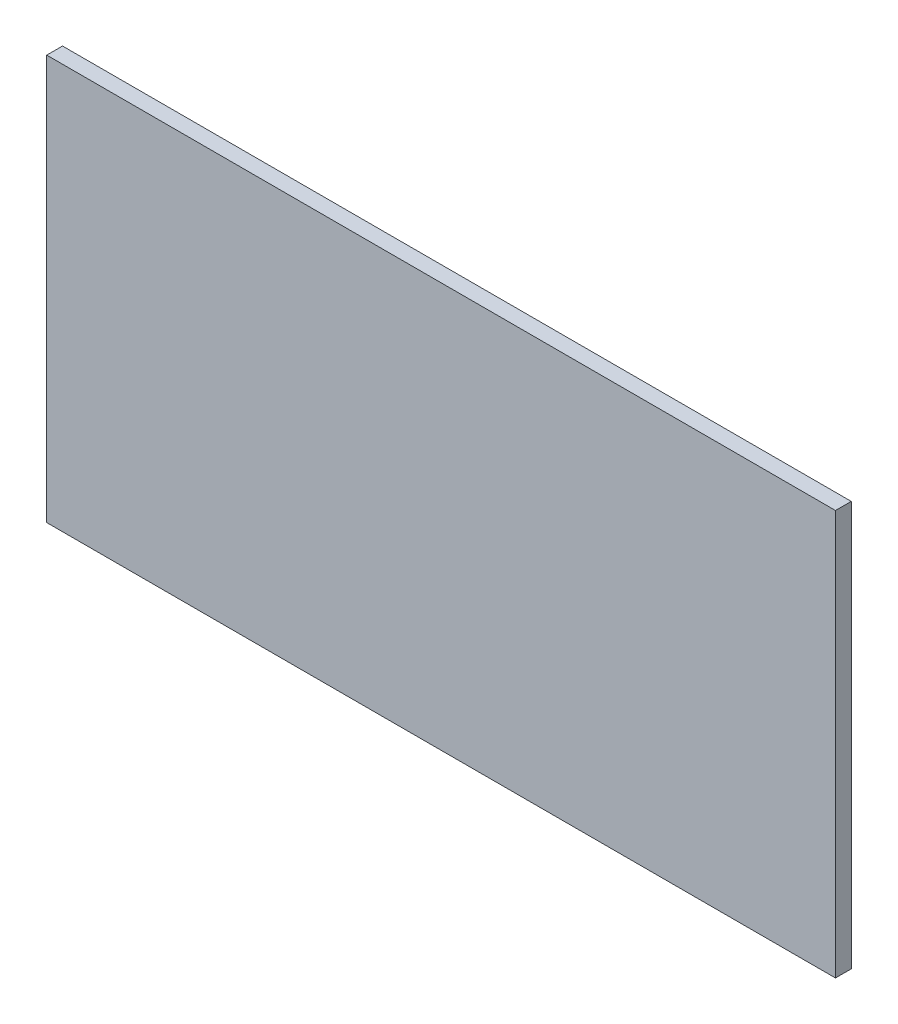
ISO-10303-21;
HEADER;
FILE_DESCRIPTION(('STEP AP214'),'2;1');
FILE_NAME('part.step','',(''),(''),'','','');
FILE_SCHEMA(('AUTOMOTIVE_DESIGN { 1 0 10303 214 1 1 1 1 }'));
ENDSEC;
DATA;
#1=APPLICATION_CONTEXT('core data for automotive mechanical design processes');
#2=APPLICATION_PROTOCOL_DEFINITION('international standard','automotive_design',2000,#1);
#3=PRODUCT_CONTEXT('',#1,'mechanical');
#4=PRODUCT('Part','Part','',(#3));
#5=PRODUCT_RELATED_PRODUCT_CATEGORY('part','',(#4));
#6=PRODUCT_DEFINITION_FORMATION('','',#4);
#7=PRODUCT_DEFINITION_CONTEXT('part definition',#1,'design');
#8=PRODUCT_DEFINITION('design','',#6,#7);
#9=PRODUCT_DEFINITION_SHAPE('','',#8);
#10=(LENGTH_UNIT() NAMED_UNIT(*) SI_UNIT(.MILLI.,.METRE.));
#11=(NAMED_UNIT(*) PLANE_ANGLE_UNIT() SI_UNIT($,.RADIAN.));
#12=(NAMED_UNIT(*) SI_UNIT($,.STERADIAN.) SOLID_ANGLE_UNIT());
#13=UNCERTAINTY_MEASURE_WITH_UNIT(LENGTH_MEASURE(1.E-05),#10,'distance_accuracy_value','');
#14=(GEOMETRIC_REPRESENTATION_CONTEXT(3) GLOBAL_UNCERTAINTY_ASSIGNED_CONTEXT((#13)) GLOBAL_UNIT_ASSIGNED_CONTEXT((#10,
#11,#12)) REPRESENTATION_CONTEXT('',''));
#15=CARTESIAN_POINT('',(0.,0.,0.));
#16=DIRECTION('',(0.,0.,1.));
#17=DIRECTION('',(1.,0.,0.));
#18=AXIS2_PLACEMENT_3D('',#15,#16,#17);
#19=CARTESIAN_POINT('',(150.,77.,6.));
#20=DIRECTION('',(-1.,0.,0.));
#21=DIRECTION('',(0.,-1.,0.));
#22=AXIS2_PLACEMENT_3D('',#19,#20,#21);
#23=PLANE('',#22);
#24=DIRECTION('',(0.,1.,0.));
#25=VECTOR('',#24,1.);
#26=CARTESIAN_POINT('',(150.,77.,0.));
#27=LINE('',#26,#25);
#28=CARTESIAN_POINT('',(150.,-77.,0.));
#29=VERTEX_POINT('',#28);
#30=CARTESIAN_POINT('',(150.,77.,0.));
#31=VERTEX_POINT('',#30);
#32=EDGE_CURVE('E98',#29,#31,#27,.T.);
#33=ORIENTED_EDGE('',*,*,#32,.T.);
#34=DIRECTION('',(0.,0.,-1.));
#35=VECTOR('',#34,1.);
#36=CARTESIAN_POINT('',(150.,77.,6.));
#37=LINE('',#36,#35);
#38=CARTESIAN_POINT('',(150.,77.,6.));
#39=VERTEX_POINT('',#38);
#40=EDGE_CURVE('E11',#39,#31,#37,.T.);
#41=ORIENTED_EDGE('',*,*,#40,.F.);
#42=DIRECTION('',(0.,1.,0.));
#43=VECTOR('',#42,1.);
#44=CARTESIAN_POINT('',(150.,77.,6.));
#45=LINE('',#44,#43);
#46=CARTESIAN_POINT('',(150.,-77.,6.));
#47=VERTEX_POINT('',#46);
#48=EDGE_CURVE('E86',#47,#39,#45,.T.);
#49=ORIENTED_EDGE('',*,*,#48,.F.);
#50=DIRECTION('',(0.,0.,-1.));
#51=VECTOR('',#50,1.);
#52=CARTESIAN_POINT('',(150.,-77.,6.));
#53=LINE('',#52,#51);
#54=EDGE_CURVE('E94',#47,#29,#53,.T.);
#55=ORIENTED_EDGE('',*,*,#54,.T.);
#56=EDGE_LOOP('',(#33,#41,#49,#55));
#57=FACE_BOUND('',#56,.T.);
#58=ADVANCED_FACE('F35',(#57),#23,.F.);
#59=CARTESIAN_POINT('',(-150.,77.,6.));
#60=DIRECTION('',(0.,-1.,0.));
#61=DIRECTION('',(0.,0.,-1.));
#62=AXIS2_PLACEMENT_3D('',#59,#60,#61);
#63=PLANE('',#62);
#64=DIRECTION('',(-1.,0.,0.));
#65=VECTOR('',#64,1.);
#66=CARTESIAN_POINT('',(-150.,77.,0.));
#67=LINE('',#66,#65);
#68=CARTESIAN_POINT('',(-150.,77.,0.));
#69=VERTEX_POINT('',#68);
#70=EDGE_CURVE('E90',#31,#69,#67,.T.);
#71=ORIENTED_EDGE('',*,*,#70,.T.);
#72=DIRECTION('',(0.,0.,-1.));
#73=VECTOR('',#72,1.);
#74=CARTESIAN_POINT('',(-150.,77.,6.));
#75=LINE('',#74,#73);
#76=CARTESIAN_POINT('',(-150.,77.,6.));
#77=VERTEX_POINT('',#76);
#78=EDGE_CURVE('E43',#77,#69,#75,.T.);
#79=ORIENTED_EDGE('',*,*,#78,.F.);
#80=DIRECTION('',(-1.,0.,0.));
#81=VECTOR('',#80,1.);
#82=CARTESIAN_POINT('',(-150.,77.,6.));
#83=LINE('',#82,#81);
#84=EDGE_CURVE('E81',#39,#77,#83,.T.);
#85=ORIENTED_EDGE('',*,*,#84,.F.);
#86=ORIENTED_EDGE('',*,*,#40,.T.);
#87=EDGE_LOOP('',(#71,#79,#85,#86));
#88=FACE_BOUND('',#87,.T.);
#89=ADVANCED_FACE('F89',(#88),#63,.F.);
#90=CARTESIAN_POINT('',(-150.,77.,6.));
#91=DIRECTION('',(1.,0.,0.));
#92=DIRECTION('',(0.,1.,0.));
#93=AXIS2_PLACEMENT_3D('',#90,#91,#92);
#94=PLANE('',#93);
#95=DIRECTION('',(0.,-1.,0.));
#96=VECTOR('',#95,1.);
#97=CARTESIAN_POINT('',(-150.,77.,0.));
#98=LINE('',#97,#96);
#99=CARTESIAN_POINT('',(-150.,-77.,0.));
#100=VERTEX_POINT('',#99);
#101=EDGE_CURVE('E68',#69,#100,#98,.T.);
#102=ORIENTED_EDGE('',*,*,#101,.T.);
#103=DIRECTION('',(0.,0.,-1.));
#104=VECTOR('',#103,1.);
#105=CARTESIAN_POINT('',(-150.,-77.,6.));
#106=LINE('',#105,#104);
#107=CARTESIAN_POINT('',(-150.,-77.,6.));
#108=VERTEX_POINT('',#107);
#109=EDGE_CURVE('E91',#108,#100,#106,.T.);
#110=ORIENTED_EDGE('',*,*,#109,.F.);
#111=DIRECTION('',(0.,-1.,0.));
#112=VECTOR('',#111,1.);
#113=CARTESIAN_POINT('',(-150.,77.,6.));
#114=LINE('',#113,#112);
#115=EDGE_CURVE('E84',#77,#108,#114,.T.);
#116=ORIENTED_EDGE('',*,*,#115,.F.);
#117=ORIENTED_EDGE('',*,*,#78,.T.);
#118=EDGE_LOOP('',(#102,#110,#116,#117));
#119=FACE_BOUND('',#118,.T.);
#120=ADVANCED_FACE('F92',(#119),#94,.F.);
#121=CARTESIAN_POINT('',(-150.,-77.,6.));
#122=DIRECTION('',(0.,1.,0.));
#123=DIRECTION('',(0.,0.,1.));
#124=AXIS2_PLACEMENT_3D('',#121,#122,#123);
#125=PLANE('',#124);
#126=DIRECTION('',(1.,0.,0.));
#127=VECTOR('',#126,1.);
#128=CARTESIAN_POINT('',(-150.,-77.,0.));
#129=LINE('',#128,#127);
#130=EDGE_CURVE('E74',#100,#29,#129,.T.);
#131=ORIENTED_EDGE('',*,*,#130,.T.);
#132=ORIENTED_EDGE('',*,*,#54,.F.);
#133=DIRECTION('',(1.,0.,0.));
#134=VECTOR('',#133,1.);
#135=CARTESIAN_POINT('',(-150.,-77.,6.));
#136=LINE('',#135,#134);
#137=EDGE_CURVE('E51',#108,#47,#136,.T.);
#138=ORIENTED_EDGE('',*,*,#137,.F.);
#139=ORIENTED_EDGE('',*,*,#109,.T.);
#140=EDGE_LOOP('',(#131,#132,#138,#139));
#141=FACE_BOUND('',#140,.T.);
#142=ADVANCED_FACE('F105',(#141),#125,.F.);
#143=CARTESIAN_POINT('',(0.,0.,6.));
#144=DIRECTION('',(0.,0.,1.));
#145=DIRECTION('',(1.,0.,0.));
#146=AXIS2_PLACEMENT_3D('',#143,#144,#145);
#147=PLANE('',#146);
#148=ORIENTED_EDGE('',*,*,#48,.T.);
#149=ORIENTED_EDGE('',*,*,#84,.T.);
#150=ORIENTED_EDGE('',*,*,#115,.T.);
#151=ORIENTED_EDGE('',*,*,#137,.T.);
#152=EDGE_LOOP('',(#148,#149,#150,#151));
#153=FACE_BOUND('',#152,.T.);
#154=ADVANCED_FACE('F82',(#153),#147,.T.);
#155=CARTESIAN_POINT('',(0.,0.,0.));
#156=DIRECTION('',(0.,0.,1.));
#157=DIRECTION('',(1.,0.,0.));
#158=AXIS2_PLACEMENT_3D('',#155,#156,#157);
#159=PLANE('',#158);
#160=ORIENTED_EDGE('',*,*,#32,.F.);
#161=ORIENTED_EDGE('',*,*,#130,.F.);
#162=ORIENTED_EDGE('',*,*,#101,.F.);
#163=ORIENTED_EDGE('',*,*,#70,.F.);
#164=EDGE_LOOP('',(#160,#161,#162,#163));
#165=FACE_BOUND('',#164,.T.);
#166=ADVANCED_FACE('F108',(#165),#159,.F.);
#167=CLOSED_SHELL('',(#58,#89,#120,#142,#154,#166));
#168=MANIFOLD_SOLID_BREP('B2',#167);
#169=ADVANCED_BREP_SHAPE_REPRESENTATION('',(#18,#168),#14);
#170=SHAPE_DEFINITION_REPRESENTATION(#9,#169);
ENDSEC;
END-ISO-10303-21;
